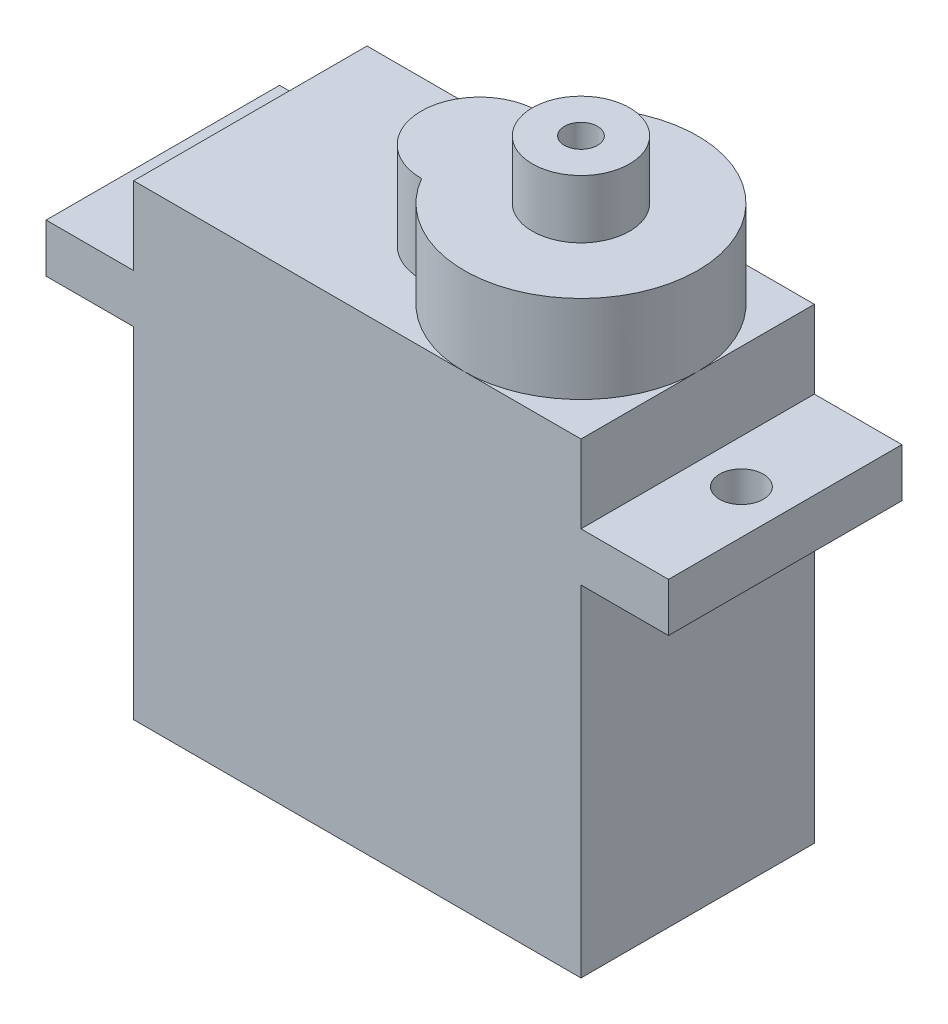
ISO-10303-21;
HEADER;
FILE_DESCRIPTION(('STEP AP214'),'2;1');
FILE_NAME('part.step','',(''),(''),'','','');
FILE_SCHEMA(('AUTOMOTIVE_DESIGN { 1 0 10303 214 1 1 1 1 }'));
ENDSEC;
DATA;
#1=APPLICATION_CONTEXT('core data for automotive mechanical design processes');
#2=APPLICATION_PROTOCOL_DEFINITION('international standard','automotive_design',2000,#1);
#3=PRODUCT_CONTEXT('',#1,'mechanical');
#4=PRODUCT('Part','Part','',(#3));
#5=PRODUCT_RELATED_PRODUCT_CATEGORY('part','',(#4));
#6=PRODUCT_DEFINITION_FORMATION('','',#4);
#7=PRODUCT_DEFINITION_CONTEXT('part definition',#1,'design');
#8=PRODUCT_DEFINITION('design','',#6,#7);
#9=PRODUCT_DEFINITION_SHAPE('','',#8);
#10=(LENGTH_UNIT() NAMED_UNIT(*) SI_UNIT(.MILLI.,.METRE.));
#11=(NAMED_UNIT(*) PLANE_ANGLE_UNIT() SI_UNIT($,.RADIAN.));
#12=(NAMED_UNIT(*) SI_UNIT($,.STERADIAN.) SOLID_ANGLE_UNIT());
#13=UNCERTAINTY_MEASURE_WITH_UNIT(LENGTH_MEASURE(1.E-05),#10,'distance_accuracy_value','');
#14=(GEOMETRIC_REPRESENTATION_CONTEXT(3) GLOBAL_UNCERTAINTY_ASSIGNED_CONTEXT((#13)) GLOBAL_UNIT_ASSIGNED_CONTEXT((#10,
#11,#12)) REPRESENTATION_CONTEXT('',''));
#15=CARTESIAN_POINT('',(0.,0.,0.));
#16=DIRECTION('',(0.,0.,1.));
#17=DIRECTION('',(1.,0.,0.));
#18=AXIS2_PLACEMENT_3D('',#15,#16,#17);
#19=CARTESIAN_POINT('',(11.5,24.,-6.));
#20=DIRECTION('',(-1.,0.,0.));
#21=DIRECTION('',(0.,0.,1.));
#22=AXIS2_PLACEMENT_3D('',#19,#20,#21);
#23=PLANE('',#22);
#24=DIRECTION('',(0.,0.,1.));
#25=VECTOR('',#24,1.);
#26=CARTESIAN_POINT('',(11.5,20.,-6.));
#27=LINE('',#26,#25);
#28=CARTESIAN_POINT('',(11.5,20.,-6.));
#29=VERTEX_POINT('',#28);
#30=CARTESIAN_POINT('',(11.5,20.,6.));
#31=VERTEX_POINT('',#30);
#32=EDGE_CURVE('E62',#29,#31,#27,.T.);
#33=ORIENTED_EDGE('',*,*,#32,.F.);
#34=DIRECTION('',(0.,-1.,0.));
#35=VECTOR('',#34,1.);
#36=CARTESIAN_POINT('',(11.5,24.,-6.));
#37=LINE('',#36,#35);
#38=CARTESIAN_POINT('',(11.5,24.,-6.));
#39=VERTEX_POINT('',#38);
#40=EDGE_CURVE('E41',#39,#29,#37,.T.);
#41=ORIENTED_EDGE('',*,*,#40,.F.);
#42=DIRECTION('',(0.,0.,-1.));
#43=VECTOR('',#42,1.);
#44=CARTESIAN_POINT('',(11.5,24.,-6.));
#45=LINE('',#44,#43);
#46=CARTESIAN_POINT('',(11.5,24.,0.));
#47=VERTEX_POINT('',#46);
#48=EDGE_CURVE('E258',#47,#39,#45,.T.);
#49=ORIENTED_EDGE('',*,*,#48,.F.);
#50=CARTESIAN_POINT('',(11.5,24.,6.));
#51=VERTEX_POINT('',#50);
#52=EDGE_CURVE('E254',#51,#47,#45,.T.);
#53=ORIENTED_EDGE('',*,*,#52,.F.);
#54=DIRECTION('',(0.,-1.,0.));
#55=VECTOR('',#54,1.);
#56=CARTESIAN_POINT('',(11.5,24.,6.));
#57=LINE('',#56,#55);
#58=EDGE_CURVE('E278',#51,#31,#57,.T.);
#59=ORIENTED_EDGE('',*,*,#58,.T.);
#60=EDGE_LOOP('',(#33,#41,#49,#53,#59));
#61=FACE_BOUND('',#60,.T.);
#62=ADVANCED_FACE('F37',(#61),#23,.F.);
#63=CARTESIAN_POINT('',(-11.5,24.,-6.));
#64=DIRECTION('',(1.,0.,0.));
#65=DIRECTION('',(0.,0.,-1.));
#66=AXIS2_PLACEMENT_3D('',#63,#64,#65);
#67=PLANE('',#66);
#68=DIRECTION('',(0.,0.,-1.));
#69=VECTOR('',#68,1.);
#70=CARTESIAN_POINT('',(-11.5,20.,-6.));
#71=LINE('',#70,#69);
#72=CARTESIAN_POINT('',(-11.5,20.,6.));
#73=VERTEX_POINT('',#72);
#74=CARTESIAN_POINT('',(-11.5,20.,-6.));
#75=VERTEX_POINT('',#74);
#76=EDGE_CURVE('E197',#73,#75,#71,.T.);
#77=ORIENTED_EDGE('',*,*,#76,.F.);
#78=DIRECTION('',(0.,-1.,0.));
#79=VECTOR('',#78,1.);
#80=CARTESIAN_POINT('',(-11.5,24.,6.));
#81=LINE('',#80,#79);
#82=CARTESIAN_POINT('',(-11.5,24.,6.));
#83=VERTEX_POINT('',#82);
#84=EDGE_CURVE('E281',#83,#73,#81,.T.);
#85=ORIENTED_EDGE('',*,*,#84,.F.);
#86=DIRECTION('',(0.,0.,1.));
#87=VECTOR('',#86,1.);
#88=CARTESIAN_POINT('',(-11.5,24.,-6.));
#89=LINE('',#88,#87);
#90=CARTESIAN_POINT('',(-11.5,24.,-6.));
#91=VERTEX_POINT('',#90);
#92=EDGE_CURVE('E262',#91,#83,#89,.T.);
#93=ORIENTED_EDGE('',*,*,#92,.F.);
#94=DIRECTION('',(0.,-1.,0.));
#95=VECTOR('',#94,1.);
#96=CARTESIAN_POINT('',(-11.5,24.,-6.));
#97=LINE('',#96,#95);
#98=EDGE_CURVE('E284',#91,#75,#97,.T.);
#99=ORIENTED_EDGE('',*,*,#98,.T.);
#100=EDGE_LOOP('',(#77,#85,#93,#99));
#101=FACE_BOUND('',#100,.T.);
#102=ADVANCED_FACE('F313',(#101),#67,.F.);
#103=CARTESIAN_POINT('',(0.,24.,0.));
#104=DIRECTION('',(0.,1.,0.));
#105=DIRECTION('',(0.,0.,1.));
#106=AXIS2_PLACEMENT_3D('',#103,#104,#105);
#107=PLANE('',#106);
#108=CARTESIAN_POINT('',(5.5,24.,0.));
#109=DIRECTION('',(0.,1.,0.));
#110=DIRECTION('',(0.,0.,1.));
#111=AXIS2_PLACEMENT_3D('',#108,#109,#110);
#112=CIRCLE('',#111,6.);
#113=CARTESIAN_POINT('',(0.303829174664103,24.,2.99996812548536));
#114=VERTEX_POINT('',#113);
#115=CARTESIAN_POINT('',(5.5,24.,6.));
#116=VERTEX_POINT('',#115);
#117=EDGE_CURVE('E234',#114,#116,#112,.T.);
#118=ORIENTED_EDGE('',*,*,#117,.F.);
#119=CARTESIAN_POINT('',(0.289999999999999,24.,0.));
#120=DIRECTION('',(0.,1.,0.));
#121=DIRECTION('',(0.,0.,1.));
#122=AXIS2_PLACEMENT_3D('',#119,#120,#121);
#123=CIRCLE('',#122,3.);
#124=CARTESIAN_POINT('',(0.303829174664103,24.,-2.99996812548536));
#125=VERTEX_POINT('',#124);
#126=EDGE_CURVE('E240',#125,#114,#123,.T.);
#127=ORIENTED_EDGE('',*,*,#126,.F.);
#128=CARTESIAN_POINT('',(5.5,24.,-6.));
#129=VERTEX_POINT('',#128);
#130=EDGE_CURVE('E245',#129,#125,#112,.T.);
#131=ORIENTED_EDGE('',*,*,#130,.F.);
#132=DIRECTION('',(-1.,0.,0.));
#133=VECTOR('',#132,1.);
#134=CARTESIAN_POINT('',(-11.5,24.,-6.));
#135=LINE('',#134,#133);
#136=EDGE_CURVE('E257',#129,#91,#135,.T.);
#137=ORIENTED_EDGE('',*,*,#136,.T.);
#138=ORIENTED_EDGE('',*,*,#92,.T.);
#139=DIRECTION('',(1.,0.,0.));
#140=VECTOR('',#139,1.);
#141=CARTESIAN_POINT('',(-11.5,24.,6.));
#142=LINE('',#141,#140);
#143=EDGE_CURVE('E265',#83,#116,#142,.T.);
#144=ORIENTED_EDGE('',*,*,#143,.T.);
#145=EDGE_LOOP('',(#118,#127,#131,#137,#138,#144));
#146=FACE_BOUND('',#145,.T.);
#147=ADVANCED_FACE('F318',(#146),#107,.T.);
#148=EDGE_CURVE('E46',#116,#47,#112,.T.);
#149=ORIENTED_EDGE('',*,*,#148,.F.);
#150=EDGE_CURVE('E264',#116,#51,#142,.T.);
#151=ORIENTED_EDGE('',*,*,#150,.T.);
#152=ORIENTED_EDGE('',*,*,#52,.T.);
#153=EDGE_LOOP('',(#149,#151,#152));
#154=FACE_BOUND('',#153,.T.);
#155=ADVANCED_FACE('F336',(#154),#107,.T.);
#156=CARTESIAN_POINT('',(11.5,17.5,-6.));
#157=VERTEX_POINT('',#156);
#158=CARTESIAN_POINT('',(11.5,0.,-6.));
#159=VERTEX_POINT('',#158);
#160=EDGE_CURVE('E54',#157,#159,#37,.T.);
#161=ORIENTED_EDGE('',*,*,#160,.F.);
#162=DIRECTION('',(0.,0.,1.));
#163=VECTOR('',#162,1.);
#164=CARTESIAN_POINT('',(11.5,17.5,-6.));
#165=LINE('',#164,#163);
#166=CARTESIAN_POINT('',(11.5,17.5,6.));
#167=VERTEX_POINT('',#166);
#168=EDGE_CURVE('E178',#157,#167,#165,.T.);
#169=ORIENTED_EDGE('',*,*,#168,.T.);
#170=CARTESIAN_POINT('',(11.5,0.,6.));
#171=VERTEX_POINT('',#170);
#172=EDGE_CURVE('E268',#167,#171,#57,.T.);
#173=ORIENTED_EDGE('',*,*,#172,.T.);
#174=DIRECTION('',(0.,0.,-1.));
#175=VECTOR('',#174,1.);
#176=CARTESIAN_POINT('',(11.5,0.,-6.));
#177=LINE('',#176,#175);
#178=EDGE_CURVE('E253',#171,#159,#177,.T.);
#179=ORIENTED_EDGE('',*,*,#178,.T.);
#180=EDGE_LOOP('',(#161,#169,#173,#179));
#181=FACE_BOUND('',#180,.T.);
#182=ADVANCED_FACE('F39',(#181),#23,.F.);
#183=CARTESIAN_POINT('',(-11.5,24.,-6.));
#184=DIRECTION('',(0.,0.,1.));
#185=DIRECTION('',(1.,0.,0.));
#186=AXIS2_PLACEMENT_3D('',#183,#184,#185);
#187=PLANE('',#186);
#188=DIRECTION('',(-1.,0.,0.));
#189=VECTOR('',#188,1.);
#190=CARTESIAN_POINT('',(-11.5,0.,-6.));
#191=LINE('',#190,#189);
#192=CARTESIAN_POINT('',(-11.5,0.,-6.));
#193=VERTEX_POINT('',#192);
#194=EDGE_CURVE('E270',#159,#193,#191,.T.);
#195=ORIENTED_EDGE('',*,*,#194,.T.);
#196=CARTESIAN_POINT('',(-11.5,17.5,-6.));
#197=VERTEX_POINT('',#196);
#198=EDGE_CURVE('E283',#197,#193,#97,.T.);
#199=ORIENTED_EDGE('',*,*,#198,.F.);
#200=DIRECTION('',(-1.,0.,0.));
#201=VECTOR('',#200,1.);
#202=CARTESIAN_POINT('',(-11.5,17.5,-6.));
#203=LINE('',#202,#201);
#204=CARTESIAN_POINT('',(-16.,17.5,-6.));
#205=VERTEX_POINT('',#204);
#206=EDGE_CURVE('E203',#197,#205,#203,.T.);
#207=ORIENTED_EDGE('',*,*,#206,.T.);
#208=DIRECTION('',(0.,1.,0.));
#209=VECTOR('',#208,1.);
#210=CARTESIAN_POINT('',(-16.,17.5,-6.));
#211=LINE('',#210,#209);
#212=CARTESIAN_POINT('',(-16.,20.,-6.));
#213=VERTEX_POINT('',#212);
#214=EDGE_CURVE('E213',#205,#213,#211,.T.);
#215=ORIENTED_EDGE('',*,*,#214,.T.);
#216=DIRECTION('',(-1.,0.,0.));
#217=VECTOR('',#216,1.);
#218=CARTESIAN_POINT('',(-11.5,20.,-6.));
#219=LINE('',#218,#217);
#220=EDGE_CURVE('E216',#75,#213,#219,.T.);
#221=ORIENTED_EDGE('',*,*,#220,.F.);
#222=ORIENTED_EDGE('',*,*,#98,.F.);
#223=ORIENTED_EDGE('',*,*,#136,.F.);
#224=EDGE_CURVE('E259',#39,#129,#135,.T.);
#225=ORIENTED_EDGE('',*,*,#224,.F.);
#226=ORIENTED_EDGE('',*,*,#40,.T.);
#227=DIRECTION('',(-1.,0.,0.));
#228=VECTOR('',#227,1.);
#229=CARTESIAN_POINT('',(11.5,20.,-6.));
#230=LINE('',#229,#228);
#231=CARTESIAN_POINT('',(16.,20.,-6.));
#232=VERTEX_POINT('',#231);
#233=EDGE_CURVE('E164',#232,#29,#230,.T.);
#234=ORIENTED_EDGE('',*,*,#233,.F.);
#235=DIRECTION('',(0.,1.,0.));
#236=VECTOR('',#235,1.);
#237=CARTESIAN_POINT('',(16.,17.5,-6.));
#238=LINE('',#237,#236);
#239=CARTESIAN_POINT('',(16.,17.5,-6.));
#240=VERTEX_POINT('',#239);
#241=EDGE_CURVE('E151',#240,#232,#238,.T.);
#242=ORIENTED_EDGE('',*,*,#241,.F.);
#243=DIRECTION('',(-1.,0.,0.));
#244=VECTOR('',#243,1.);
#245=CARTESIAN_POINT('',(11.5,17.5,-6.));
#246=LINE('',#245,#244);
#247=EDGE_CURVE('E175',#240,#157,#246,.T.);
#248=ORIENTED_EDGE('',*,*,#247,.T.);
#249=ORIENTED_EDGE('',*,*,#160,.T.);
#250=EDGE_LOOP('',(#195,#199,#207,#215,#221,#222,#223,#225,#226,#234,#242,#248,#249));
#251=FACE_BOUND('',#250,.T.);
#252=ADVANCED_FACE('F166',(#251),#187,.F.);
#253=CARTESIAN_POINT('',(-11.5,17.5,6.));
#254=VERTEX_POINT('',#253);
#255=CARTESIAN_POINT('',(-11.5,0.,6.));
#256=VERTEX_POINT('',#255);
#257=EDGE_CURVE('E280',#254,#256,#81,.T.);
#258=ORIENTED_EDGE('',*,*,#257,.F.);
#259=DIRECTION('',(0.,0.,-1.));
#260=VECTOR('',#259,1.);
#261=CARTESIAN_POINT('',(-11.5,17.5,-6.));
#262=LINE('',#261,#260);
#263=EDGE_CURVE('E200',#254,#197,#262,.T.);
#264=ORIENTED_EDGE('',*,*,#263,.T.);
#265=ORIENTED_EDGE('',*,*,#198,.T.);
#266=DIRECTION('',(0.,0.,1.));
#267=VECTOR('',#266,1.);
#268=CARTESIAN_POINT('',(-11.5,0.,-6.));
#269=LINE('',#268,#267);
#270=EDGE_CURVE('E272',#193,#256,#269,.T.);
#271=ORIENTED_EDGE('',*,*,#270,.T.);
#272=EDGE_LOOP('',(#258,#264,#265,#271));
#273=FACE_BOUND('',#272,.T.);
#274=ADVANCED_FACE('F293',(#273),#67,.F.);
#275=CARTESIAN_POINT('',(-11.5,24.,6.));
#276=DIRECTION('',(0.,0.,-1.));
#277=DIRECTION('',(-1.,0.,0.));
#278=AXIS2_PLACEMENT_3D('',#275,#276,#277);
#279=PLANE('',#278);
#280=DIRECTION('',(1.,0.,0.));
#281=VECTOR('',#280,1.);
#282=CARTESIAN_POINT('',(-11.5,0.,6.));
#283=LINE('',#282,#281);
#284=EDGE_CURVE('E275',#256,#171,#283,.T.);
#285=ORIENTED_EDGE('',*,*,#284,.T.);
#286=ORIENTED_EDGE('',*,*,#172,.F.);
#287=DIRECTION('',(1.,0.,0.));
#288=VECTOR('',#287,1.);
#289=CARTESIAN_POINT('',(11.5,17.5,6.));
#290=LINE('',#289,#288);
#291=CARTESIAN_POINT('',(16.,17.5,6.));
#292=VERTEX_POINT('',#291);
#293=EDGE_CURVE('E184',#167,#292,#290,.T.);
#294=ORIENTED_EDGE('',*,*,#293,.T.);
#295=DIRECTION('',(0.,1.,0.));
#296=VECTOR('',#295,1.);
#297=CARTESIAN_POINT('',(16.,17.5,6.));
#298=LINE('',#297,#296);
#299=CARTESIAN_POINT('',(16.,20.,6.));
#300=VERTEX_POINT('',#299);
#301=EDGE_CURVE('E161',#292,#300,#298,.T.);
#302=ORIENTED_EDGE('',*,*,#301,.T.);
#303=DIRECTION('',(1.,0.,0.));
#304=VECTOR('',#303,1.);
#305=CARTESIAN_POINT('',(11.5,20.,6.));
#306=LINE('',#305,#304);
#307=EDGE_CURVE('E174',#31,#300,#306,.T.);
#308=ORIENTED_EDGE('',*,*,#307,.F.);
#309=ORIENTED_EDGE('',*,*,#58,.F.);
#310=ORIENTED_EDGE('',*,*,#150,.F.);
#311=ORIENTED_EDGE('',*,*,#143,.F.);
#312=ORIENTED_EDGE('',*,*,#84,.T.);
#313=DIRECTION('',(1.,0.,0.));
#314=VECTOR('',#313,1.);
#315=CARTESIAN_POINT('',(-11.5,20.,6.));
#316=LINE('',#315,#314);
#317=CARTESIAN_POINT('',(-16.,20.,6.));
#318=VERTEX_POINT('',#317);
#319=EDGE_CURVE('E204',#318,#73,#316,.T.);
#320=ORIENTED_EDGE('',*,*,#319,.F.);
#321=DIRECTION('',(0.,1.,0.));
#322=VECTOR('',#321,1.);
#323=CARTESIAN_POINT('',(-16.,17.5,6.));
#324=LINE('',#323,#322);
#325=CARTESIAN_POINT('',(-16.,17.5,6.));
#326=VERTEX_POINT('',#325);
#327=EDGE_CURVE('E223',#326,#318,#324,.T.);
#328=ORIENTED_EDGE('',*,*,#327,.F.);
#329=DIRECTION('',(1.,0.,0.));
#330=VECTOR('',#329,1.);
#331=CARTESIAN_POINT('',(-11.5,17.5,6.));
#332=LINE('',#331,#330);
#333=EDGE_CURVE('E210',#326,#254,#332,.T.);
#334=ORIENTED_EDGE('',*,*,#333,.T.);
#335=ORIENTED_EDGE('',*,*,#257,.T.);
#336=EDGE_LOOP('',(#285,#286,#294,#302,#308,#309,#310,#311,#312,#320,#328,#334,#335));
#337=FACE_BOUND('',#336,.T.);
#338=ADVANCED_FACE('F301',(#337),#279,.F.);
#339=EDGE_CURVE('E330',#47,#129,#112,.T.);
#340=ORIENTED_EDGE('',*,*,#339,.F.);
#341=ORIENTED_EDGE('',*,*,#48,.T.);
#342=ORIENTED_EDGE('',*,*,#224,.T.);
#343=EDGE_LOOP('',(#340,#341,#342));
#344=FACE_BOUND('',#343,.T.);
#345=ADVANCED_FACE('F333',(#344),#107,.T.);
#346=CARTESIAN_POINT('',(0.,0.,0.));
#347=DIRECTION('',(0.,1.,0.));
#348=DIRECTION('',(0.,0.,1.));
#349=AXIS2_PLACEMENT_3D('',#346,#347,#348);
#350=PLANE('',#349);
#351=ORIENTED_EDGE('',*,*,#178,.F.);
#352=ORIENTED_EDGE('',*,*,#284,.F.);
#353=ORIENTED_EDGE('',*,*,#270,.F.);
#354=ORIENTED_EDGE('',*,*,#194,.F.);
#355=EDGE_LOOP('',(#351,#352,#353,#354));
#356=FACE_BOUND('',#355,.T.);
#357=ADVANCED_FACE('F299',(#356),#350,.F.);
#358=CARTESIAN_POINT('',(5.5,28.5,0.));
#359=DIRECTION('',(0.,-1.,0.));
#360=DIRECTION('',(0.,0.,-1.));
#361=AXIS2_PLACEMENT_3D('',#358,#359,#360);
#362=CYLINDRICAL_SURFACE('',#361,6.);
#363=ORIENTED_EDGE('',*,*,#117,.T.);
#364=ORIENTED_EDGE('',*,*,#148,.T.);
#365=ORIENTED_EDGE('',*,*,#339,.T.);
#366=ORIENTED_EDGE('',*,*,#130,.T.);
#367=DIRECTION('',(0.,-1.,0.));
#368=VECTOR('',#367,1.);
#369=CARTESIAN_POINT('',(0.303829174664103,28.5,-2.99996812548536));
#370=LINE('',#369,#368);
#371=CARTESIAN_POINT('',(0.303829174664103,28.5,-2.99996812548536));
#372=VERTEX_POINT('',#371);
#373=EDGE_CURVE('E250',#372,#125,#370,.T.);
#374=ORIENTED_EDGE('',*,*,#373,.F.);
#375=CARTESIAN_POINT('',(5.5,28.5,0.));
#376=DIRECTION('',(0.,1.,0.));
#377=DIRECTION('',(0.,0.,1.));
#378=AXIS2_PLACEMENT_3D('',#375,#376,#377);
#379=CIRCLE('',#378,6.);
#380=CARTESIAN_POINT('',(0.303829174664103,28.5,2.99996812548536));
#381=VERTEX_POINT('',#380);
#382=EDGE_CURVE('E236',#381,#372,#379,.T.);
#383=ORIENTED_EDGE('',*,*,#382,.F.);
#384=DIRECTION('',(0.,-1.,0.));
#385=VECTOR('',#384,1.);
#386=CARTESIAN_POINT('',(0.303829174664103,28.5,2.99996812548536));
#387=LINE('',#386,#385);
#388=EDGE_CURVE('E242',#381,#114,#387,.T.);
#389=ORIENTED_EDGE('',*,*,#388,.T.);
#390=EDGE_LOOP('',(#363,#364,#365,#366,#374,#383,#389));
#391=FACE_BOUND('',#390,.T.);
#392=ADVANCED_FACE('F321',(#391),#362,.T.);
#393=CARTESIAN_POINT('',(0.289999999999999,28.5,0.));
#394=DIRECTION('',(0.,-1.,0.));
#395=DIRECTION('',(0.,0.,-1.));
#396=AXIS2_PLACEMENT_3D('',#393,#394,#395);
#397=CYLINDRICAL_SURFACE('',#396,3.);
#398=ORIENTED_EDGE('',*,*,#126,.T.);
#399=ORIENTED_EDGE('',*,*,#388,.F.);
#400=CARTESIAN_POINT('',(0.289999999999999,28.5,0.));
#401=DIRECTION('',(0.,1.,0.));
#402=DIRECTION('',(0.,0.,1.));
#403=AXIS2_PLACEMENT_3D('',#400,#401,#402);
#404=CIRCLE('',#403,3.);
#405=EDGE_CURVE('E239',#372,#381,#404,.T.);
#406=ORIENTED_EDGE('',*,*,#405,.F.);
#407=ORIENTED_EDGE('',*,*,#373,.T.);
#408=EDGE_LOOP('',(#398,#399,#406,#407));
#409=FACE_BOUND('',#408,.T.);
#410=ADVANCED_FACE('F327',(#409),#397,.T.);
#411=CARTESIAN_POINT('',(2.895,28.5,0.));
#412=DIRECTION('',(0.,1.,0.));
#413=DIRECTION('',(0.,0.,1.));
#414=AXIS2_PLACEMENT_3D('',#411,#412,#413);
#415=PLANE('',#414);
#416=CARTESIAN_POINT('',(5.5,28.5,0.));
#417=DIRECTION('',(0.,1.,0.));
#418=DIRECTION('',(0.,0.,1.));
#419=AXIS2_PLACEMENT_3D('',#416,#417,#418);
#420=CIRCLE('',#419,2.5);
#421=CARTESIAN_POINT('',(5.5,28.5,2.5));
#422=VERTEX_POINT('',#421);
#423=EDGE_CURVE('E11',#422,#422,#420,.T.);
#424=ORIENTED_EDGE('',*,*,#423,.F.);
#425=EDGE_LOOP('',(#424));
#426=FACE_BOUND('',#425,.T.);
#427=ORIENTED_EDGE('',*,*,#382,.T.);
#428=ORIENTED_EDGE('',*,*,#405,.T.);
#429=EDGE_LOOP('',(#427,#428));
#430=FACE_BOUND('',#429,.T.);
#431=ADVANCED_FACE('F369',(#426,#430),#415,.T.);
#432=CARTESIAN_POINT('',(5.5,31.5,0.));
#433=DIRECTION('',(0.,-1.,0.));
#434=DIRECTION('',(0.,0.,-1.));
#435=AXIS2_PLACEMENT_3D('',#432,#433,#434);
#436=CYLINDRICAL_SURFACE('',#435,2.5);
#437=CARTESIAN_POINT('',(5.5,31.5,0.));
#438=DIRECTION('',(0.,1.,0.));
#439=DIRECTION('',(0.,0.,1.));
#440=AXIS2_PLACEMENT_3D('',#437,#438,#439);
#441=CIRCLE('',#440,2.5);
#442=CARTESIAN_POINT('',(5.5,31.5,2.5));
#443=VERTEX_POINT('',#442);
#444=EDGE_CURVE('E230',#443,#443,#441,.T.);
#445=ORIENTED_EDGE('',*,*,#444,.F.);
#446=EDGE_LOOP('',(#445));
#447=FACE_BOUND('',#446,.T.);
#448=ORIENTED_EDGE('',*,*,#423,.T.);
#449=EDGE_LOOP('',(#448));
#450=FACE_BOUND('',#449,.T.);
#451=ADVANCED_FACE('F372',(#447,#450),#436,.T.);
#452=CARTESIAN_POINT('',(5.5,31.5,0.));
#453=DIRECTION('',(0.,1.,0.));
#454=DIRECTION('',(0.,0.,1.));
#455=AXIS2_PLACEMENT_3D('',#452,#453,#454);
#456=PLANE('',#455);
#457=CARTESIAN_POINT('',(5.5,31.5,0.));
#458=DIRECTION('',(0.,1.,0.));
#459=DIRECTION('',(0.,0.,1.));
#460=AXIS2_PLACEMENT_3D('',#457,#458,#459);
#461=CIRCLE('',#460,0.85);
#462=CARTESIAN_POINT('',(5.5,31.5,0.85));
#463=VERTEX_POINT('',#462);
#464=EDGE_CURVE('E225',#463,#463,#461,.T.);
#465=ORIENTED_EDGE('',*,*,#464,.F.);
#466=EDGE_LOOP('',(#465));
#467=FACE_BOUND('',#466,.T.);
#468=ORIENTED_EDGE('',*,*,#444,.T.);
#469=EDGE_LOOP('',(#468));
#470=FACE_BOUND('',#469,.T.);
#471=ADVANCED_FACE('F376',(#467,#470),#456,.T.);
#472=CARTESIAN_POINT('',(5.5,26.5,0.));
#473=DIRECTION('',(0.,1.,0.));
#474=DIRECTION('',(0.,0.,1.));
#475=AXIS2_PLACEMENT_3D('',#472,#473,#474);
#476=CYLINDRICAL_SURFACE('',#475,0.85);
#477=CARTESIAN_POINT('',(5.5,26.5,0.));
#478=DIRECTION('',(0.,1.,0.));
#479=DIRECTION('',(0.,0.,1.));
#480=AXIS2_PLACEMENT_3D('',#477,#478,#479);
#481=CIRCLE('',#480,0.85);
#482=CARTESIAN_POINT('',(5.5,26.5,0.85));
#483=VERTEX_POINT('',#482);
#484=EDGE_CURVE('E227',#483,#483,#481,.T.);
#485=ORIENTED_EDGE('',*,*,#484,.F.);
#486=EDGE_LOOP('',(#485));
#487=FACE_BOUND('',#486,.T.);
#488=ORIENTED_EDGE('',*,*,#464,.T.);
#489=EDGE_LOOP('',(#488));
#490=FACE_BOUND('',#489,.T.);
#491=ADVANCED_FACE('F380',(#487,#490),#476,.F.);
#492=CARTESIAN_POINT('',(5.5,26.5,0.));
#493=DIRECTION('',(0.,1.,0.));
#494=DIRECTION('',(0.,0.,1.));
#495=AXIS2_PLACEMENT_3D('',#492,#493,#494);
#496=PLANE('',#495);
#497=ORIENTED_EDGE('',*,*,#484,.T.);
#498=EDGE_LOOP('',(#497));
#499=FACE_BOUND('',#498,.T.);
#500=ADVANCED_FACE('F384',(#499),#496,.T.);
#501=CARTESIAN_POINT('',(-16.,17.5,-6.));
#502=DIRECTION('',(-1.,0.,0.));
#503=DIRECTION('',(0.,0.,1.));
#504=AXIS2_PLACEMENT_3D('',#501,#502,#503);
#505=PLANE('',#504);
#506=DIRECTION('',(0.,0.,1.));
#507=VECTOR('',#506,1.);
#508=CARTESIAN_POINT('',(-16.,20.,-6.));
#509=LINE('',#508,#507);
#510=EDGE_CURVE('E219',#213,#318,#509,.T.);
#511=ORIENTED_EDGE('',*,*,#510,.F.);
#512=ORIENTED_EDGE('',*,*,#214,.F.);
#513=DIRECTION('',(0.,0.,1.));
#514=VECTOR('',#513,1.);
#515=CARTESIAN_POINT('',(-16.,17.5,-6.));
#516=LINE('',#515,#514);
#517=EDGE_CURVE('E207',#205,#326,#516,.T.);
#518=ORIENTED_EDGE('',*,*,#517,.T.);
#519=ORIENTED_EDGE('',*,*,#327,.T.);
#520=EDGE_LOOP('',(#511,#512,#518,#519));
#521=FACE_BOUND('',#520,.T.);
#522=ADVANCED_FACE('F309',(#521),#505,.T.);
#523=CARTESIAN_POINT('',(0.,17.5,0.));
#524=DIRECTION('',(0.,-1.,0.));
#525=DIRECTION('',(0.,0.,-1.));
#526=AXIS2_PLACEMENT_3D('',#523,#524,#525);
#527=PLANE('',#526);
#528=CARTESIAN_POINT('',(-13.75,17.5,0.));
#529=DIRECTION('',(0.,1.,0.));
#530=DIRECTION('',(0.,0.,1.));
#531=AXIS2_PLACEMENT_3D('',#528,#529,#530);
#532=CIRCLE('',#531,1.125);
#533=CARTESIAN_POINT('',(-13.75,17.5,1.125));
#534=VERTEX_POINT('',#533);
#535=EDGE_CURVE('E194',#534,#534,#532,.T.);
#536=ORIENTED_EDGE('',*,*,#535,.T.);
#537=EDGE_LOOP('',(#536));
#538=FACE_BOUND('',#537,.T.);
#539=ORIENTED_EDGE('',*,*,#263,.F.);
#540=ORIENTED_EDGE('',*,*,#333,.F.);
#541=ORIENTED_EDGE('',*,*,#517,.F.);
#542=ORIENTED_EDGE('',*,*,#206,.F.);
#543=EDGE_LOOP('',(#539,#540,#541,#542));
#544=FACE_BOUND('',#543,.T.);
#545=ADVANCED_FACE('F306',(#538,#544),#527,.T.);
#546=CARTESIAN_POINT('',(0.,20.,0.));
#547=DIRECTION('',(0.,-1.,0.));
#548=DIRECTION('',(0.,0.,-1.));
#549=AXIS2_PLACEMENT_3D('',#546,#547,#548);
#550=PLANE('',#549);
#551=CARTESIAN_POINT('',(-13.75,20.,0.));
#552=DIRECTION('',(0.,1.,0.));
#553=DIRECTION('',(0.,0.,1.));
#554=AXIS2_PLACEMENT_3D('',#551,#552,#553);
#555=CIRCLE('',#554,1.125);
#556=CARTESIAN_POINT('',(-13.75,20.,1.125));
#557=VERTEX_POINT('',#556);
#558=EDGE_CURVE('E191',#557,#557,#555,.T.);
#559=ORIENTED_EDGE('',*,*,#558,.F.);
#560=EDGE_LOOP('',(#559));
#561=FACE_BOUND('',#560,.T.);
#562=ORIENTED_EDGE('',*,*,#76,.T.);
#563=ORIENTED_EDGE('',*,*,#220,.T.);
#564=ORIENTED_EDGE('',*,*,#510,.T.);
#565=ORIENTED_EDGE('',*,*,#319,.T.);
#566=EDGE_LOOP('',(#562,#563,#564,#565));
#567=FACE_BOUND('',#566,.T.);
#568=ADVANCED_FACE('F311',(#561,#567),#550,.F.);
#569=CARTESIAN_POINT('',(-13.75,17.5,0.));
#570=DIRECTION('',(0.,1.,0.));
#571=DIRECTION('',(0.,0.,1.));
#572=AXIS2_PLACEMENT_3D('',#569,#570,#571);
#573=CYLINDRICAL_SURFACE('',#572,1.125);
#574=ORIENTED_EDGE('',*,*,#535,.F.);
#575=EDGE_LOOP('',(#574));
#576=FACE_BOUND('',#575,.T.);
#577=ORIENTED_EDGE('',*,*,#558,.T.);
#578=EDGE_LOOP('',(#577));
#579=FACE_BOUND('',#578,.T.);
#580=ADVANCED_FACE('F393',(#576,#579),#573,.F.);
#581=CARTESIAN_POINT('',(16.,17.5,-6.));
#582=DIRECTION('',(1.,0.,0.));
#583=DIRECTION('',(0.,0.,-1.));
#584=AXIS2_PLACEMENT_3D('',#581,#582,#583);
#585=PLANE('',#584);
#586=DIRECTION('',(0.,0.,-1.));
#587=VECTOR('',#586,1.);
#588=CARTESIAN_POINT('',(16.,20.,-6.));
#589=LINE('',#588,#587);
#590=EDGE_CURVE('E155',#300,#232,#589,.T.);
#591=ORIENTED_EDGE('',*,*,#590,.F.);
#592=ORIENTED_EDGE('',*,*,#301,.F.);
#593=DIRECTION('',(0.,0.,-1.));
#594=VECTOR('',#593,1.);
#595=CARTESIAN_POINT('',(16.,17.5,-6.));
#596=LINE('',#595,#594);
#597=EDGE_CURVE('E157',#292,#240,#596,.T.);
#598=ORIENTED_EDGE('',*,*,#597,.T.);
#599=ORIENTED_EDGE('',*,*,#241,.T.);
#600=EDGE_LOOP('',(#591,#592,#598,#599));
#601=FACE_BOUND('',#600,.T.);
#602=ADVANCED_FACE('F153',(#601),#585,.T.);
#603=CARTESIAN_POINT('',(0.,17.5,0.));
#604=DIRECTION('',(0.,-1.,0.));
#605=DIRECTION('',(0.,0.,-1.));
#606=AXIS2_PLACEMENT_3D('',#603,#604,#605);
#607=PLANE('',#606);
#608=CARTESIAN_POINT('',(13.75,17.5,0.));
#609=DIRECTION('',(0.,1.,0.));
#610=DIRECTION('',(0.,0.,-1.));
#611=AXIS2_PLACEMENT_3D('',#608,#609,#610);
#612=CIRCLE('',#611,1.125);
#613=CARTESIAN_POINT('',(13.75,17.5,-1.125));
#614=VERTEX_POINT('',#613);
#615=EDGE_CURVE('E169',#614,#614,#612,.T.);
#616=ORIENTED_EDGE('',*,*,#615,.T.);
#617=EDGE_LOOP('',(#616));
#618=FACE_BOUND('',#617,.T.);
#619=ORIENTED_EDGE('',*,*,#247,.F.);
#620=ORIENTED_EDGE('',*,*,#597,.F.);
#621=ORIENTED_EDGE('',*,*,#293,.F.);
#622=ORIENTED_EDGE('',*,*,#168,.F.);
#623=EDGE_LOOP('',(#619,#620,#621,#622));
#624=FACE_BOUND('',#623,.T.);
#625=ADVANCED_FACE('F339',(#618,#624),#607,.T.);
#626=CARTESIAN_POINT('',(0.,20.,0.));
#627=DIRECTION('',(0.,-1.,0.));
#628=DIRECTION('',(0.,0.,-1.));
#629=AXIS2_PLACEMENT_3D('',#626,#627,#628);
#630=PLANE('',#629);
#631=CARTESIAN_POINT('',(13.75,20.,0.));
#632=DIRECTION('',(0.,1.,0.));
#633=DIRECTION('',(0.,0.,-1.));
#634=AXIS2_PLACEMENT_3D('',#631,#632,#633);
#635=CIRCLE('',#634,1.125);
#636=CARTESIAN_POINT('',(13.75,20.,-1.125));
#637=VERTEX_POINT('',#636);
#638=EDGE_CURVE('E188',#637,#637,#635,.T.);
#639=ORIENTED_EDGE('',*,*,#638,.F.);
#640=EDGE_LOOP('',(#639));
#641=FACE_BOUND('',#640,.T.);
#642=ORIENTED_EDGE('',*,*,#233,.T.);
#643=ORIENTED_EDGE('',*,*,#32,.T.);
#644=ORIENTED_EDGE('',*,*,#307,.T.);
#645=ORIENTED_EDGE('',*,*,#590,.T.);
#646=EDGE_LOOP('',(#642,#643,#644,#645));
#647=FACE_BOUND('',#646,.T.);
#648=ADVANCED_FACE('F172',(#641,#647),#630,.F.);
#649=CARTESIAN_POINT('',(13.75,17.5,0.));
#650=DIRECTION('',(0.,1.,0.));
#651=DIRECTION('',(0.,0.,1.));
#652=AXIS2_PLACEMENT_3D('',#649,#650,#651);
#653=CYLINDRICAL_SURFACE('',#652,1.125);
#654=ORIENTED_EDGE('',*,*,#615,.F.);
#655=EDGE_LOOP('',(#654));
#656=FACE_BOUND('',#655,.T.);
#657=ORIENTED_EDGE('',*,*,#638,.T.);
#658=EDGE_LOOP('',(#657));
#659=FACE_BOUND('',#658,.T.);
#660=ADVANCED_FACE('F401',(#656,#659),#653,.F.);
#661=CLOSED_SHELL('',(#62,#102,#147,#155,#182,#252,#274,#338,#345,#357,#392,#410,#431,#451,#471,
#491,#500,#522,#545,#568,#580,#602,#625,#648,#660));
#662=MANIFOLD_SOLID_BREP('B2',#661);
#663=ADVANCED_BREP_SHAPE_REPRESENTATION('',(#18,#662),#14);
#664=SHAPE_DEFINITION_REPRESENTATION(#9,#663);
ENDSEC;
END-ISO-10303-21;
